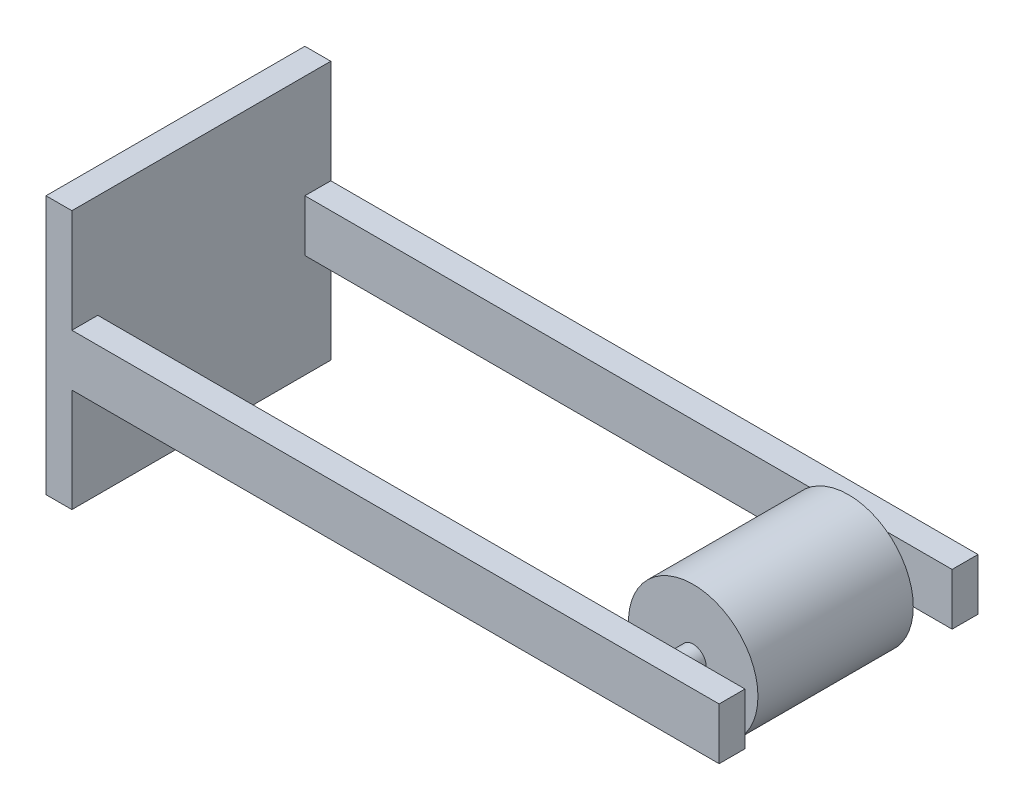
ISO-10303-21;
HEADER;
FILE_DESCRIPTION(('STEP AP214'),'2;1');
FILE_NAME('part.step','',(''),(''),'','','');
FILE_SCHEMA(('AUTOMOTIVE_DESIGN { 1 0 10303 214 1 1 1 1 }'));
ENDSEC;
DATA;
#1=APPLICATION_CONTEXT('core data for automotive mechanical design processes');
#2=APPLICATION_PROTOCOL_DEFINITION('international standard','automotive_design',2000,#1);
#3=PRODUCT_CONTEXT('',#1,'mechanical');
#4=PRODUCT('Part','Part','',(#3));
#5=PRODUCT_RELATED_PRODUCT_CATEGORY('part','',(#4));
#6=PRODUCT_DEFINITION_FORMATION('','',#4);
#7=PRODUCT_DEFINITION_CONTEXT('part definition',#1,'design');
#8=PRODUCT_DEFINITION('design','',#6,#7);
#9=PRODUCT_DEFINITION_SHAPE('','',#8);
#10=(LENGTH_UNIT() NAMED_UNIT(*) SI_UNIT(.MILLI.,.METRE.));
#11=(NAMED_UNIT(*) PLANE_ANGLE_UNIT() SI_UNIT($,.RADIAN.));
#12=(NAMED_UNIT(*) SI_UNIT($,.STERADIAN.) SOLID_ANGLE_UNIT());
#13=UNCERTAINTY_MEASURE_WITH_UNIT(LENGTH_MEASURE(1.E-05),#10,'distance_accuracy_value','');
#14=(GEOMETRIC_REPRESENTATION_CONTEXT(3) GLOBAL_UNCERTAINTY_ASSIGNED_CONTEXT((#13)) GLOBAL_UNIT_ASSIGNED_CONTEXT((#10,
#11,#12)) REPRESENTATION_CONTEXT('',''));
#15=CARTESIAN_POINT('',(0.,0.,0.));
#16=DIRECTION('',(0.,0.,1.));
#17=DIRECTION('',(1.,0.,0.));
#18=AXIS2_PLACEMENT_3D('',#15,#16,#17);
#19=CARTESIAN_POINT('',(23.,5.,-9.));
#20=DIRECTION('',(0.,0.,1.));
#21=DIRECTION('',(1.,0.,0.));
#22=AXIS2_PLACEMENT_3D('',#19,#20,#21);
#23=CYLINDRICAL_SURFACE('',#22,2.5);
#24=CARTESIAN_POINT('',(23.,5.,-2.));
#25=DIRECTION('',(0.,0.,1.));
#26=DIRECTION('',(1.,0.,0.));
#27=AXIS2_PLACEMENT_3D('',#24,#25,#26);
#28=CIRCLE('',#27,2.5);
#29=CARTESIAN_POINT('',(25.5,5.,-2.));
#30=VERTEX_POINT('',#29);
#31=EDGE_CURVE('E158',#30,#30,#28,.T.);
#32=ORIENTED_EDGE('',*,*,#31,.F.);
#33=EDGE_LOOP('',(#32));
#34=FACE_BOUND('',#33,.T.);
#35=CARTESIAN_POINT('',(23.,5.,-8.));
#36=DIRECTION('',(0.,0.,-1.));
#37=DIRECTION('',(-1.,0.,0.));
#38=AXIS2_PLACEMENT_3D('',#35,#36,#37);
#39=CIRCLE('',#38,2.5);
#40=CARTESIAN_POINT('',(20.5,5.,-8.));
#41=VERTEX_POINT('',#40);
#42=EDGE_CURVE('E252',#41,#41,#39,.T.);
#43=ORIENTED_EDGE('',*,*,#42,.F.);
#44=EDGE_LOOP('',(#43));
#45=FACE_BOUND('',#44,.T.);
#46=ADVANCED_FACE('F41',(#34,#45),#23,.T.);
#47=CARTESIAN_POINT('',(1.,0.,0.));
#48=DIRECTION('',(-1.,0.,0.));
#49=DIRECTION('',(0.,0.,1.));
#50=AXIS2_PLACEMENT_3D('',#47,#48,#49);
#51=PLANE('',#50);
#52=DIRECTION('',(0.,1.,0.));
#53=VECTOR('',#52,1.);
#54=CARTESIAN_POINT('',(1.,0.,-10.));
#55=LINE('',#54,#53);
#56=CARTESIAN_POINT('',(1.,0.,-10.));
#57=VERTEX_POINT('',#56);
#58=CARTESIAN_POINT('',(1.,4.,-10.));
#59=VERTEX_POINT('',#58);
#60=EDGE_CURVE('E203',#57,#59,#55,.T.);
#61=ORIENTED_EDGE('',*,*,#60,.T.);
#62=DIRECTION('',(0.,0.,-1.));
#63=VECTOR('',#62,1.);
#64=CARTESIAN_POINT('',(1.,4.,-9.));
#65=LINE('',#64,#63);
#66=CARTESIAN_POINT('',(1.,4.,-9.));
#67=VERTEX_POINT('',#66);
#68=EDGE_CURVE('E163',#67,#59,#65,.T.);
#69=ORIENTED_EDGE('',*,*,#68,.F.);
#70=DIRECTION('',(0.,1.,0.));
#71=VECTOR('',#70,1.);
#72=CARTESIAN_POINT('',(1.,4.,-9.));
#73=LINE('',#72,#71);
#74=CARTESIAN_POINT('',(1.,6.,-9.));
#75=VERTEX_POINT('',#74);
#76=EDGE_CURVE('E63',#67,#75,#73,.T.);
#77=ORIENTED_EDGE('',*,*,#76,.T.);
#78=DIRECTION('',(0.,0.,-1.));
#79=VECTOR('',#78,1.);
#80=CARTESIAN_POINT('',(1.,6.,-9.));
#81=LINE('',#80,#79);
#82=CARTESIAN_POINT('',(1.,6.,-10.));
#83=VERTEX_POINT('',#82);
#84=EDGE_CURVE('E137',#75,#83,#81,.T.);
#85=ORIENTED_EDGE('',*,*,#84,.T.);
#86=CARTESIAN_POINT('',(1.,10.,-10.));
#87=VERTEX_POINT('',#86);
#88=EDGE_CURVE('E202',#83,#87,#55,.T.);
#89=ORIENTED_EDGE('',*,*,#88,.T.);
#90=DIRECTION('',(0.,0.,1.));
#91=VECTOR('',#90,1.);
#92=CARTESIAN_POINT('',(1.,10.,0.));
#93=LINE('',#92,#91);
#94=CARTESIAN_POINT('',(1.,10.,0.));
#95=VERTEX_POINT('',#94);
#96=EDGE_CURVE('E205',#87,#95,#93,.T.);
#97=ORIENTED_EDGE('',*,*,#96,.T.);
#98=DIRECTION('',(0.,-1.,0.));
#99=VECTOR('',#98,1.);
#100=CARTESIAN_POINT('',(1.,0.,0.));
#101=LINE('',#100,#99);
#102=CARTESIAN_POINT('',(1.,6.,0.));
#103=VERTEX_POINT('',#102);
#104=EDGE_CURVE('E196',#95,#103,#101,.T.);
#105=ORIENTED_EDGE('',*,*,#104,.T.);
#106=DIRECTION('',(0.,0.,1.));
#107=VECTOR('',#106,1.);
#108=CARTESIAN_POINT('',(1.,6.,-1.));
#109=LINE('',#108,#107);
#110=CARTESIAN_POINT('',(1.,6.,-1.));
#111=VERTEX_POINT('',#110);
#112=EDGE_CURVE('E187',#111,#103,#109,.T.);
#113=ORIENTED_EDGE('',*,*,#112,.F.);
#114=DIRECTION('',(0.,-1.,0.));
#115=VECTOR('',#114,1.);
#116=CARTESIAN_POINT('',(1.,4.,-1.));
#117=LINE('',#116,#115);
#118=CARTESIAN_POINT('',(1.,4.,-1.));
#119=VERTEX_POINT('',#118);
#120=EDGE_CURVE('E168',#111,#119,#117,.T.);
#121=ORIENTED_EDGE('',*,*,#120,.T.);
#122=DIRECTION('',(0.,0.,1.));
#123=VECTOR('',#122,1.);
#124=CARTESIAN_POINT('',(1.,4.,-1.));
#125=LINE('',#124,#123);
#126=CARTESIAN_POINT('',(1.,4.,0.));
#127=VERTEX_POINT('',#126);
#128=EDGE_CURVE('E179',#119,#127,#125,.T.);
#129=ORIENTED_EDGE('',*,*,#128,.T.);
#130=CARTESIAN_POINT('',(1.,0.,0.));
#131=VERTEX_POINT('',#130);
#132=EDGE_CURVE('E200',#127,#131,#101,.T.);
#133=ORIENTED_EDGE('',*,*,#132,.T.);
#134=DIRECTION('',(0.,0.,-1.));
#135=VECTOR('',#134,1.);
#136=CARTESIAN_POINT('',(1.,0.,0.));
#137=LINE('',#136,#135);
#138=EDGE_CURVE('E199',#131,#57,#137,.T.);
#139=ORIENTED_EDGE('',*,*,#138,.T.);
#140=EDGE_LOOP('',(#61,#69,#77,#85,#89,#97,#105,#113,#121,#129,#133,#139));
#141=FACE_BOUND('',#140,.T.);
#142=ADVANCED_FACE('F242',(#141),#51,.F.);
#143=CARTESIAN_POINT('',(1.,0.,0.));
#144=DIRECTION('',(0.,0.,-1.));
#145=DIRECTION('',(-1.,0.,0.));
#146=AXIS2_PLACEMENT_3D('',#143,#144,#145);
#147=PLANE('',#146);
#148=DIRECTION('',(0.,-1.,0.));
#149=VECTOR('',#148,1.);
#150=CARTESIAN_POINT('',(0.,0.,0.));
#151=LINE('',#150,#149);
#152=CARTESIAN_POINT('',(0.,10.,0.));
#153=VERTEX_POINT('',#152);
#154=CARTESIAN_POINT('',(0.,0.,0.));
#155=VERTEX_POINT('',#154);
#156=EDGE_CURVE('E189',#153,#155,#151,.T.);
#157=ORIENTED_EDGE('',*,*,#156,.T.);
#158=DIRECTION('',(-1.,0.,0.));
#159=VECTOR('',#158,1.);
#160=CARTESIAN_POINT('',(1.,0.,0.));
#161=LINE('',#160,#159);
#162=EDGE_CURVE('E12',#131,#155,#161,.T.);
#163=ORIENTED_EDGE('',*,*,#162,.F.);
#164=ORIENTED_EDGE('',*,*,#132,.F.);
#165=DIRECTION('',(1.,0.,0.));
#166=VECTOR('',#165,1.);
#167=CARTESIAN_POINT('',(26.,4.,0.));
#168=LINE('',#167,#166);
#169=CARTESIAN_POINT('',(26.,4.,0.));
#170=VERTEX_POINT('',#169);
#171=EDGE_CURVE('E165',#127,#170,#168,.T.);
#172=ORIENTED_EDGE('',*,*,#171,.T.);
#173=DIRECTION('',(0.,1.,0.));
#174=VECTOR('',#173,1.);
#175=CARTESIAN_POINT('',(26.,6.,0.));
#176=LINE('',#175,#174);
#177=CARTESIAN_POINT('',(26.,6.,0.));
#178=VERTEX_POINT('',#177);
#179=EDGE_CURVE('E182',#170,#178,#176,.T.);
#180=ORIENTED_EDGE('',*,*,#179,.T.);
#181=DIRECTION('',(-1.,0.,0.));
#182=VECTOR('',#181,1.);
#183=CARTESIAN_POINT('',(1.,6.,0.));
#184=LINE('',#183,#182);
#185=EDGE_CURVE('E172',#178,#103,#184,.T.);
#186=ORIENTED_EDGE('',*,*,#185,.T.);
#187=ORIENTED_EDGE('',*,*,#104,.F.);
#188=DIRECTION('',(-1.,0.,0.));
#189=VECTOR('',#188,1.);
#190=CARTESIAN_POINT('',(1.,10.,0.));
#191=LINE('',#190,#189);
#192=EDGE_CURVE('E207',#95,#153,#191,.T.);
#193=ORIENTED_EDGE('',*,*,#192,.T.);
#194=EDGE_LOOP('',(#157,#163,#164,#172,#180,#186,#187,#193));
#195=FACE_BOUND('',#194,.T.);
#196=ADVANCED_FACE('F43',(#195),#147,.F.);
#197=CARTESIAN_POINT('',(1.,0.,0.));
#198=DIRECTION('',(0.,1.,0.));
#199=DIRECTION('',(0.,0.,1.));
#200=AXIS2_PLACEMENT_3D('',#197,#198,#199);
#201=PLANE('',#200);
#202=DIRECTION('',(0.,0.,-1.));
#203=VECTOR('',#202,1.);
#204=CARTESIAN_POINT('',(0.,0.,0.));
#205=LINE('',#204,#203);
#206=CARTESIAN_POINT('',(0.,0.,-10.));
#207=VERTEX_POINT('',#206);
#208=EDGE_CURVE('E210',#155,#207,#205,.T.);
#209=ORIENTED_EDGE('',*,*,#208,.T.);
#210=DIRECTION('',(-1.,0.,0.));
#211=VECTOR('',#210,1.);
#212=CARTESIAN_POINT('',(1.,0.,-10.));
#213=LINE('',#212,#211);
#214=EDGE_CURVE('E49',#57,#207,#213,.T.);
#215=ORIENTED_EDGE('',*,*,#214,.F.);
#216=ORIENTED_EDGE('',*,*,#138,.F.);
#217=ORIENTED_EDGE('',*,*,#162,.T.);
#218=EDGE_LOOP('',(#209,#215,#216,#217));
#219=FACE_BOUND('',#218,.T.);
#220=ADVANCED_FACE('F315',(#219),#201,.F.);
#221=CARTESIAN_POINT('',(1.,0.,-10.));
#222=DIRECTION('',(0.,0.,1.));
#223=DIRECTION('',(1.,0.,0.));
#224=AXIS2_PLACEMENT_3D('',#221,#222,#223);
#225=PLANE('',#224);
#226=DIRECTION('',(0.,1.,0.));
#227=VECTOR('',#226,1.);
#228=CARTESIAN_POINT('',(0.,0.,-10.));
#229=LINE('',#228,#227);
#230=CARTESIAN_POINT('',(0.,10.,-10.));
#231=VERTEX_POINT('',#230);
#232=EDGE_CURVE('E212',#207,#231,#229,.T.);
#233=ORIENTED_EDGE('',*,*,#232,.T.);
#234=DIRECTION('',(-1.,0.,0.));
#235=VECTOR('',#234,1.);
#236=CARTESIAN_POINT('',(1.,10.,-10.));
#237=LINE('',#236,#235);
#238=EDGE_CURVE('E218',#87,#231,#237,.T.);
#239=ORIENTED_EDGE('',*,*,#238,.F.);
#240=ORIENTED_EDGE('',*,*,#88,.F.);
#241=DIRECTION('',(1.,0.,0.));
#242=VECTOR('',#241,1.);
#243=CARTESIAN_POINT('',(1.,6.,-10.));
#244=LINE('',#243,#242);
#245=CARTESIAN_POINT('',(26.,6.,-10.));
#246=VERTEX_POINT('',#245);
#247=EDGE_CURVE('E156',#83,#246,#244,.T.);
#248=ORIENTED_EDGE('',*,*,#247,.T.);
#249=DIRECTION('',(0.,-1.,0.));
#250=VECTOR('',#249,1.);
#251=CARTESIAN_POINT('',(26.,6.,-10.));
#252=LINE('',#251,#250);
#253=CARTESIAN_POINT('',(26.,4.,-10.));
#254=VERTEX_POINT('',#253);
#255=EDGE_CURVE('E146',#246,#254,#252,.T.);
#256=ORIENTED_EDGE('',*,*,#255,.T.);
#257=DIRECTION('',(-1.,0.,0.));
#258=VECTOR('',#257,1.);
#259=CARTESIAN_POINT('',(26.,4.,-10.));
#260=LINE('',#259,#258);
#261=EDGE_CURVE('E160',#254,#59,#260,.T.);
#262=ORIENTED_EDGE('',*,*,#261,.T.);
#263=ORIENTED_EDGE('',*,*,#60,.F.);
#264=ORIENTED_EDGE('',*,*,#214,.T.);
#265=EDGE_LOOP('',(#233,#239,#240,#248,#256,#262,#263,#264));
#266=FACE_BOUND('',#265,.T.);
#267=ADVANCED_FACE('F225',(#266),#225,.F.);
#268=CARTESIAN_POINT('',(1.,10.,0.));
#269=DIRECTION('',(0.,-1.,0.));
#270=DIRECTION('',(0.,0.,-1.));
#271=AXIS2_PLACEMENT_3D('',#268,#269,#270);
#272=PLANE('',#271);
#273=DIRECTION('',(0.,0.,1.));
#274=VECTOR('',#273,1.);
#275=CARTESIAN_POINT('',(0.,10.,0.));
#276=LINE('',#275,#274);
#277=EDGE_CURVE('E214',#231,#153,#276,.T.);
#278=ORIENTED_EDGE('',*,*,#277,.T.);
#279=ORIENTED_EDGE('',*,*,#192,.F.);
#280=ORIENTED_EDGE('',*,*,#96,.F.);
#281=ORIENTED_EDGE('',*,*,#238,.T.);
#282=EDGE_LOOP('',(#278,#279,#280,#281));
#283=FACE_BOUND('',#282,.T.);
#284=ADVANCED_FACE('F235',(#283),#272,.F.);
#285=CARTESIAN_POINT('',(0.,0.,0.));
#286=DIRECTION('',(-1.,0.,0.));
#287=DIRECTION('',(0.,0.,1.));
#288=AXIS2_PLACEMENT_3D('',#285,#286,#287);
#289=PLANE('',#288);
#290=ORIENTED_EDGE('',*,*,#156,.F.);
#291=ORIENTED_EDGE('',*,*,#277,.F.);
#292=ORIENTED_EDGE('',*,*,#232,.F.);
#293=ORIENTED_EDGE('',*,*,#208,.F.);
#294=EDGE_LOOP('',(#290,#291,#292,#293));
#295=FACE_BOUND('',#294,.T.);
#296=ADVANCED_FACE('F232',(#295),#289,.T.);
#297=CARTESIAN_POINT('',(1.,6.,-1.));
#298=DIRECTION('',(0.,1.,0.));
#299=DIRECTION('',(0.,0.,1.));
#300=AXIS2_PLACEMENT_3D('',#297,#298,#299);
#301=PLANE('',#300);
#302=ORIENTED_EDGE('',*,*,#185,.F.);
#303=DIRECTION('',(0.,0.,1.));
#304=VECTOR('',#303,1.);
#305=CARTESIAN_POINT('',(26.,6.,-1.));
#306=LINE('',#305,#304);
#307=CARTESIAN_POINT('',(26.,6.,-1.));
#308=VERTEX_POINT('',#307);
#309=EDGE_CURVE('E190',#308,#178,#306,.T.);
#310=ORIENTED_EDGE('',*,*,#309,.F.);
#311=DIRECTION('',(-1.,0.,0.));
#312=VECTOR('',#311,1.);
#313=CARTESIAN_POINT('',(1.,6.,-1.));
#314=LINE('',#313,#312);
#315=EDGE_CURVE('E177',#308,#111,#314,.T.);
#316=ORIENTED_EDGE('',*,*,#315,.T.);
#317=ORIENTED_EDGE('',*,*,#112,.T.);
#318=EDGE_LOOP('',(#302,#310,#316,#317));
#319=FACE_BOUND('',#318,.T.);
#320=ADVANCED_FACE('F299',(#319),#301,.T.);
#321=CARTESIAN_POINT('',(26.,6.,-1.));
#322=DIRECTION('',(1.,0.,0.));
#323=DIRECTION('',(0.,0.,-1.));
#324=AXIS2_PLACEMENT_3D('',#321,#322,#323);
#325=PLANE('',#324);
#326=ORIENTED_EDGE('',*,*,#179,.F.);
#327=DIRECTION('',(0.,0.,1.));
#328=VECTOR('',#327,1.);
#329=CARTESIAN_POINT('',(26.,4.,-1.));
#330=LINE('',#329,#328);
#331=CARTESIAN_POINT('',(26.,4.,-1.));
#332=VERTEX_POINT('',#331);
#333=EDGE_CURVE('E192',#332,#170,#330,.T.);
#334=ORIENTED_EDGE('',*,*,#333,.F.);
#335=DIRECTION('',(0.,1.,0.));
#336=VECTOR('',#335,1.);
#337=CARTESIAN_POINT('',(26.,6.,-1.));
#338=LINE('',#337,#336);
#339=EDGE_CURVE('E174',#332,#308,#338,.T.);
#340=ORIENTED_EDGE('',*,*,#339,.T.);
#341=ORIENTED_EDGE('',*,*,#309,.T.);
#342=EDGE_LOOP('',(#326,#334,#340,#341));
#343=FACE_BOUND('',#342,.T.);
#344=ADVANCED_FACE('F302',(#343),#325,.T.);
#345=CARTESIAN_POINT('',(26.,4.,-1.));
#346=DIRECTION('',(0.,-1.,0.));
#347=DIRECTION('',(1.,0.,0.));
#348=AXIS2_PLACEMENT_3D('',#345,#346,#347);
#349=PLANE('',#348);
#350=ORIENTED_EDGE('',*,*,#171,.F.);
#351=ORIENTED_EDGE('',*,*,#128,.F.);
#352=DIRECTION('',(1.,0.,0.));
#353=VECTOR('',#352,1.);
#354=CARTESIAN_POINT('',(26.,4.,-1.));
#355=LINE('',#354,#353);
#356=EDGE_CURVE('E171',#119,#332,#355,.T.);
#357=ORIENTED_EDGE('',*,*,#356,.T.);
#358=ORIENTED_EDGE('',*,*,#333,.T.);
#359=EDGE_LOOP('',(#350,#351,#357,#358));
#360=FACE_BOUND('',#359,.T.);
#361=ADVANCED_FACE('F297',(#360),#349,.T.);
#362=CARTESIAN_POINT('',(0.,0.,-1.));
#363=DIRECTION('',(0.,0.,-1.));
#364=DIRECTION('',(-1.,0.,0.));
#365=AXIS2_PLACEMENT_3D('',#362,#363,#364);
#366=PLANE('',#365);
#367=ORIENTED_EDGE('',*,*,#120,.F.);
#368=ORIENTED_EDGE('',*,*,#315,.F.);
#369=ORIENTED_EDGE('',*,*,#339,.F.);
#370=ORIENTED_EDGE('',*,*,#356,.F.);
#371=EDGE_LOOP('',(#367,#368,#369,#370));
#372=FACE_BOUND('',#371,.T.);
#373=CARTESIAN_POINT('',(23.,5.,-1.));
#374=DIRECTION('',(0.,0.,1.));
#375=DIRECTION('',(1.,0.,0.));
#376=AXIS2_PLACEMENT_3D('',#373,#374,#375);
#377=CIRCLE('',#376,0.499999999999999);
#378=CARTESIAN_POINT('',(23.5,5.,-1.));
#379=VERTEX_POINT('',#378);
#380=EDGE_CURVE('E249',#379,#379,#377,.T.);
#381=ORIENTED_EDGE('',*,*,#380,.T.);
#382=EDGE_LOOP('',(#381));
#383=FACE_BOUND('',#382,.T.);
#384=ADVANCED_FACE('F290',(#372,#383),#366,.T.);
#385=CARTESIAN_POINT('',(26.,4.,-9.));
#386=DIRECTION('',(0.,-1.,0.));
#387=DIRECTION('',(1.,0.,0.));
#388=AXIS2_PLACEMENT_3D('',#385,#386,#387);
#389=PLANE('',#388);
#390=ORIENTED_EDGE('',*,*,#261,.F.);
#391=DIRECTION('',(0.,0.,-1.));
#392=VECTOR('',#391,1.);
#393=CARTESIAN_POINT('',(26.,4.,-9.));
#394=LINE('',#393,#392);
#395=CARTESIAN_POINT('',(26.,4.,-9.));
#396=VERTEX_POINT('',#395);
#397=EDGE_CURVE('E148',#396,#254,#394,.T.);
#398=ORIENTED_EDGE('',*,*,#397,.F.);
#399=DIRECTION('',(-1.,0.,0.));
#400=VECTOR('',#399,1.);
#401=CARTESIAN_POINT('',(26.,4.,-9.));
#402=LINE('',#401,#400);
#403=EDGE_CURVE('E56',#396,#67,#402,.T.);
#404=ORIENTED_EDGE('',*,*,#403,.T.);
#405=ORIENTED_EDGE('',*,*,#68,.T.);
#406=EDGE_LOOP('',(#390,#398,#404,#405));
#407=FACE_BOUND('',#406,.T.);
#408=ADVANCED_FACE('F244',(#407),#389,.T.);
#409=CARTESIAN_POINT('',(26.,6.,-9.));
#410=DIRECTION('',(1.,0.,0.));
#411=DIRECTION('',(0.,0.,-1.));
#412=AXIS2_PLACEMENT_3D('',#409,#410,#411);
#413=PLANE('',#412);
#414=ORIENTED_EDGE('',*,*,#255,.F.);
#415=DIRECTION('',(0.,0.,-1.));
#416=VECTOR('',#415,1.);
#417=CARTESIAN_POINT('',(26.,6.,-9.));
#418=LINE('',#417,#416);
#419=CARTESIAN_POINT('',(26.,6.,-9.));
#420=VERTEX_POINT('',#419);
#421=EDGE_CURVE('E135',#420,#246,#418,.T.);
#422=ORIENTED_EDGE('',*,*,#421,.F.);
#423=DIRECTION('',(0.,-1.,0.));
#424=VECTOR('',#423,1.);
#425=CARTESIAN_POINT('',(26.,6.,-9.));
#426=LINE('',#425,#424);
#427=EDGE_CURVE('E140',#420,#396,#426,.T.);
#428=ORIENTED_EDGE('',*,*,#427,.T.);
#429=ORIENTED_EDGE('',*,*,#397,.T.);
#430=EDGE_LOOP('',(#414,#422,#428,#429));
#431=FACE_BOUND('',#430,.T.);
#432=ADVANCED_FACE('F144',(#431),#413,.T.);
#433=CARTESIAN_POINT('',(1.,6.,-9.));
#434=DIRECTION('',(0.,1.,0.));
#435=DIRECTION('',(0.,0.,1.));
#436=AXIS2_PLACEMENT_3D('',#433,#434,#435);
#437=PLANE('',#436);
#438=ORIENTED_EDGE('',*,*,#247,.F.);
#439=ORIENTED_EDGE('',*,*,#84,.F.);
#440=DIRECTION('',(1.,0.,0.));
#441=VECTOR('',#440,1.);
#442=CARTESIAN_POINT('',(1.,6.,-9.));
#443=LINE('',#442,#441);
#444=EDGE_CURVE('E131',#75,#420,#443,.T.);
#445=ORIENTED_EDGE('',*,*,#444,.T.);
#446=ORIENTED_EDGE('',*,*,#421,.T.);
#447=EDGE_LOOP('',(#438,#439,#445,#446));
#448=FACE_BOUND('',#447,.T.);
#449=ADVANCED_FACE('F134',(#448),#437,.T.);
#450=CARTESIAN_POINT('',(0.,0.,-9.));
#451=DIRECTION('',(0.,0.,-1.));
#452=DIRECTION('',(-1.,0.,0.));
#453=AXIS2_PLACEMENT_3D('',#450,#451,#452);
#454=PLANE('',#453);
#455=ORIENTED_EDGE('',*,*,#76,.F.);
#456=ORIENTED_EDGE('',*,*,#403,.F.);
#457=ORIENTED_EDGE('',*,*,#427,.F.);
#458=ORIENTED_EDGE('',*,*,#444,.F.);
#459=EDGE_LOOP('',(#455,#456,#457,#458));
#460=FACE_BOUND('',#459,.T.);
#461=CARTESIAN_POINT('',(23.,5.,-9.));
#462=DIRECTION('',(0.,0.,-1.));
#463=DIRECTION('',(-1.,0.,0.));
#464=AXIS2_PLACEMENT_3D('',#461,#462,#463);
#465=CIRCLE('',#464,0.499999999999999);
#466=CARTESIAN_POINT('',(22.5,5.,-9.));
#467=VERTEX_POINT('',#466);
#468=EDGE_CURVE('E258',#467,#467,#465,.T.);
#469=ORIENTED_EDGE('',*,*,#468,.T.);
#470=EDGE_LOOP('',(#469));
#471=FACE_BOUND('',#470,.T.);
#472=ADVANCED_FACE('F150',(#460,#471),#454,.F.);
#473=CARTESIAN_POINT('',(23.,5.,-2.));
#474=DIRECTION('',(0.,0.,1.));
#475=DIRECTION('',(1.,0.,0.));
#476=AXIS2_PLACEMENT_3D('',#473,#474,#475);
#477=PLANE('',#476);
#478=CARTESIAN_POINT('',(23.,5.,-2.));
#479=DIRECTION('',(0.,0.,1.));
#480=DIRECTION('',(1.,0.,0.));
#481=AXIS2_PLACEMENT_3D('',#478,#479,#480);
#482=CIRCLE('',#481,0.499999999999999);
#483=CARTESIAN_POINT('',(23.5,5.,-2.));
#484=VERTEX_POINT('',#483);
#485=EDGE_CURVE('E248',#484,#484,#482,.T.);
#486=ORIENTED_EDGE('',*,*,#485,.F.);
#487=EDGE_LOOP('',(#486));
#488=FACE_BOUND('',#487,.T.);
#489=ORIENTED_EDGE('',*,*,#31,.T.);
#490=EDGE_LOOP('',(#489));
#491=FACE_BOUND('',#490,.T.);
#492=ADVANCED_FACE('F284',(#488,#491),#477,.T.);
#493=CARTESIAN_POINT('',(23.,5.,-2.));
#494=DIRECTION('',(0.,0.,1.));
#495=DIRECTION('',(1.,0.,0.));
#496=AXIS2_PLACEMENT_3D('',#493,#494,#495);
#497=CYLINDRICAL_SURFACE('',#496,0.499999999999999);
#498=ORIENTED_EDGE('',*,*,#485,.T.);
#499=EDGE_LOOP('',(#498));
#500=FACE_BOUND('',#499,.T.);
#501=ORIENTED_EDGE('',*,*,#380,.F.);
#502=EDGE_LOOP('',(#501));
#503=FACE_BOUND('',#502,.T.);
#504=ADVANCED_FACE('F270',(#500,#503),#497,.T.);
#505=CARTESIAN_POINT('',(23.,5.,-8.));
#506=DIRECTION('',(0.,0.,-1.));
#507=DIRECTION('',(-1.,0.,0.));
#508=AXIS2_PLACEMENT_3D('',#505,#506,#507);
#509=PLANE('',#508);
#510=CARTESIAN_POINT('',(23.,5.,-8.));
#511=DIRECTION('',(0.,0.,-1.));
#512=DIRECTION('',(-1.,0.,0.));
#513=AXIS2_PLACEMENT_3D('',#510,#511,#512);
#514=CIRCLE('',#513,0.499999999999999);
#515=CARTESIAN_POINT('',(22.5,5.,-8.));
#516=VERTEX_POINT('',#515);
#517=EDGE_CURVE('E257',#516,#516,#514,.T.);
#518=ORIENTED_EDGE('',*,*,#517,.F.);
#519=EDGE_LOOP('',(#518));
#520=FACE_BOUND('',#519,.T.);
#521=ORIENTED_EDGE('',*,*,#42,.T.);
#522=EDGE_LOOP('',(#521));
#523=FACE_BOUND('',#522,.T.);
#524=ADVANCED_FACE('F267',(#520,#523),#509,.T.);
#525=CARTESIAN_POINT('',(23.,5.,-8.));
#526=DIRECTION('',(0.,0.,-1.));
#527=DIRECTION('',(-1.,0.,0.));
#528=AXIS2_PLACEMENT_3D('',#525,#526,#527);
#529=CYLINDRICAL_SURFACE('',#528,0.499999999999999);
#530=ORIENTED_EDGE('',*,*,#517,.T.);
#531=EDGE_LOOP('',(#530));
#532=FACE_BOUND('',#531,.T.);
#533=ORIENTED_EDGE('',*,*,#468,.F.);
#534=EDGE_LOOP('',(#533));
#535=FACE_BOUND('',#534,.T.);
#536=ADVANCED_FACE('F264',(#532,#535),#529,.T.);
#537=CLOSED_SHELL('',(#46,#142,#196,#220,#267,#284,#296,#320,#344,#361,#384,#408,#432,#449,#472,
#492,#504,#524,#536));
#538=MANIFOLD_SOLID_BREP('B2',#537);
#539=ADVANCED_BREP_SHAPE_REPRESENTATION('',(#18,#538),#14);
#540=SHAPE_DEFINITION_REPRESENTATION(#9,#539);
ENDSEC;
END-ISO-10303-21;
